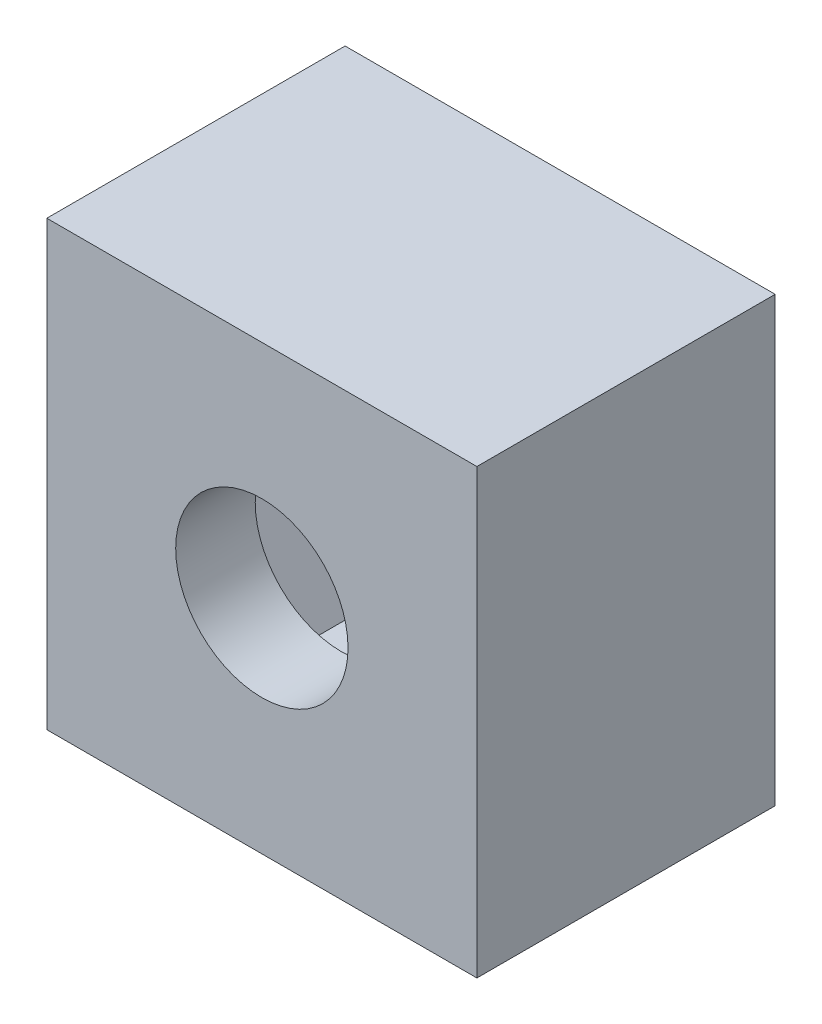
ISO-10303-21;
HEADER;
FILE_DESCRIPTION(('STEP AP214'),'2;1');
FILE_NAME('part.step','',(''),(''),'','','');
FILE_SCHEMA(('AUTOMOTIVE_DESIGN { 1 0 10303 214 1 1 1 1 }'));
ENDSEC;
DATA;
#1=APPLICATION_CONTEXT('core data for automotive mechanical design processes');
#2=APPLICATION_PROTOCOL_DEFINITION('international standard','automotive_design',2000,#1);
#3=PRODUCT_CONTEXT('',#1,'mechanical');
#4=PRODUCT('Part','Part','',(#3));
#5=PRODUCT_RELATED_PRODUCT_CATEGORY('part','',(#4));
#6=PRODUCT_DEFINITION_FORMATION('','',#4);
#7=PRODUCT_DEFINITION_CONTEXT('part definition',#1,'design');
#8=PRODUCT_DEFINITION('design','',#6,#7);
#9=PRODUCT_DEFINITION_SHAPE('','',#8);
#10=(LENGTH_UNIT() NAMED_UNIT(*) SI_UNIT(.MILLI.,.METRE.));
#11=(NAMED_UNIT(*) PLANE_ANGLE_UNIT() SI_UNIT($,.RADIAN.));
#12=(NAMED_UNIT(*) SI_UNIT($,.STERADIAN.) SOLID_ANGLE_UNIT());
#13=UNCERTAINTY_MEASURE_WITH_UNIT(LENGTH_MEASURE(1.E-05),#10,'distance_accuracy_value','');
#14=(GEOMETRIC_REPRESENTATION_CONTEXT(3) GLOBAL_UNCERTAINTY_ASSIGNED_CONTEXT((#13)) GLOBAL_UNIT_ASSIGNED_CONTEXT((#10,
#11,#12)) REPRESENTATION_CONTEXT('',''));
#15=CARTESIAN_POINT('',(0.,0.,0.));
#16=DIRECTION('',(0.,0.,1.));
#17=DIRECTION('',(1.,0.,0.));
#18=AXIS2_PLACEMENT_3D('',#15,#16,#17);
#19=CARTESIAN_POINT('',(0.,-8.35340964975421,5.25));
#20=DIRECTION('',(0.,1.,0.));
#21=DIRECTION('',(0.,0.,1.));
#22=AXIS2_PLACEMENT_3D('',#19,#20,#21);
#23=PLANE('',#22);
#24=DIRECTION('',(0.,0.,-1.));
#25=VECTOR('',#24,1.);
#26=CARTESIAN_POINT('',(-8.11027539957601,-8.35340964975421,5.25));
#27=LINE('',#26,#25);
#28=CARTESIAN_POINT('',(-8.11027539957601,-8.35340964975421,8.25));
#29=VERTEX_POINT('',#28);
#30=CARTESIAN_POINT('',(-8.11027539957601,-8.35340964975421,-3.));
#31=VERTEX_POINT('',#30);
#32=EDGE_CURVE('E110',#29,#31,#27,.T.);
#33=ORIENTED_EDGE('',*,*,#32,.T.);
#34=DIRECTION('',(1.,0.,0.));
#35=VECTOR('',#34,1.);
#36=CARTESIAN_POINT('',(0.,-8.35340964975421,-3.));
#37=LINE('',#36,#35);
#38=CARTESIAN_POINT('',(8.11027539957601,-8.35340964975421,-3.));
#39=VERTEX_POINT('',#38);
#40=EDGE_CURVE('E425',#31,#39,#37,.T.);
#41=ORIENTED_EDGE('',*,*,#40,.T.);
#42=DIRECTION('',(0.,0.,-1.));
#43=VECTOR('',#42,1.);
#44=CARTESIAN_POINT('',(8.11027539957601,-8.35340964975421,5.25));
#45=LINE('',#44,#43);
#46=CARTESIAN_POINT('',(8.11027539957601,-8.35340964975421,8.25));
#47=VERTEX_POINT('',#46);
#48=EDGE_CURVE('E11',#47,#39,#45,.T.);
#49=ORIENTED_EDGE('',*,*,#48,.F.);
#50=DIRECTION('',(1.,0.,0.));
#51=VECTOR('',#50,1.);
#52=CARTESIAN_POINT('',(-8.11027539957601,-8.35340964975421,8.25));
#53=LINE('',#52,#51);
#54=EDGE_CURVE('E388',#29,#47,#53,.T.);
#55=ORIENTED_EDGE('',*,*,#54,.F.);
#56=EDGE_LOOP('',(#33,#41,#49,#55));
#57=FACE_BOUND('',#56,.T.);
#58=ADVANCED_FACE('F39',(#57),#23,.F.);
#59=CARTESIAN_POINT('',(8.11027539957601,0.,5.25));
#60=DIRECTION('',(-1.,0.,0.));
#61=DIRECTION('',(0.,0.,1.));
#62=AXIS2_PLACEMENT_3D('',#59,#60,#61);
#63=PLANE('',#62);
#64=ORIENTED_EDGE('',*,*,#48,.T.);
#65=DIRECTION('',(0.,1.,0.));
#66=VECTOR('',#65,1.);
#67=CARTESIAN_POINT('',(8.11027539957601,0.,-3.));
#68=LINE('',#67,#66);
#69=CARTESIAN_POINT('',(8.11027539957601,8.35340964975421,-3.));
#70=VERTEX_POINT('',#69);
#71=EDGE_CURVE('E420',#39,#70,#68,.T.);
#72=ORIENTED_EDGE('',*,*,#71,.T.);
#73=DIRECTION('',(0.,0.,-1.));
#74=VECTOR('',#73,1.);
#75=CARTESIAN_POINT('',(8.11027539957601,8.35340964975421,5.25));
#76=LINE('',#75,#74);
#77=CARTESIAN_POINT('',(8.11027539957601,8.35340964975421,8.25));
#78=VERTEX_POINT('',#77);
#79=EDGE_CURVE('E49',#78,#70,#76,.T.);
#80=ORIENTED_EDGE('',*,*,#79,.F.);
#81=DIRECTION('',(0.,1.,0.));
#82=VECTOR('',#81,1.);
#83=CARTESIAN_POINT('',(8.11027539957601,8.35340964975421,8.25));
#84=LINE('',#83,#82);
#85=EDGE_CURVE('E391',#47,#78,#84,.T.);
#86=ORIENTED_EDGE('',*,*,#85,.F.);
#87=EDGE_LOOP('',(#64,#72,#80,#86));
#88=FACE_BOUND('',#87,.T.);
#89=ADVANCED_FACE('F162',(#88),#63,.F.);
#90=CARTESIAN_POINT('',(0.,8.35340964975421,5.25));
#91=DIRECTION('',(0.,1.,0.));
#92=DIRECTION('',(0.,0.,1.));
#93=AXIS2_PLACEMENT_3D('',#90,#91,#92);
#94=PLANE('',#93);
#95=ORIENTED_EDGE('',*,*,#79,.T.);
#96=DIRECTION('',(1.,0.,0.));
#97=VECTOR('',#96,1.);
#98=CARTESIAN_POINT('',(0.,8.35340964975421,-3.));
#99=LINE('',#98,#97);
#100=CARTESIAN_POINT('',(-8.11027539957601,8.35340964975421,-3.));
#101=VERTEX_POINT('',#100);
#102=EDGE_CURVE('E382',#101,#70,#99,.T.);
#103=ORIENTED_EDGE('',*,*,#102,.F.);
#104=DIRECTION('',(0.,0.,-1.));
#105=VECTOR('',#104,1.);
#106=CARTESIAN_POINT('',(-8.11027539957601,8.35340964975421,5.25));
#107=LINE('',#106,#105);
#108=CARTESIAN_POINT('',(-8.11027539957601,8.35340964975421,8.25));
#109=VERTEX_POINT('',#108);
#110=EDGE_CURVE('E113',#109,#101,#107,.T.);
#111=ORIENTED_EDGE('',*,*,#110,.F.);
#112=DIRECTION('',(-1.,0.,0.));
#113=VECTOR('',#112,1.);
#114=CARTESIAN_POINT('',(-8.11027539957601,8.35340964975421,8.25));
#115=LINE('',#114,#113);
#116=EDGE_CURVE('E143',#78,#109,#115,.T.);
#117=ORIENTED_EDGE('',*,*,#116,.F.);
#118=EDGE_LOOP('',(#95,#103,#111,#117));
#119=FACE_BOUND('',#118,.T.);
#120=ADVANCED_FACE('F168',(#119),#94,.T.);
#121=CARTESIAN_POINT('',(4.69097093716571,-2.70833333333333,5.25));
#122=DIRECTION('',(-0.866025403784439,0.5,0.));
#123=DIRECTION('',(-0.5,-0.866025403784439,0.));
#124=AXIS2_PLACEMENT_3D('',#121,#122,#123);
#125=PLANE('',#124);
#126=DIRECTION('',(0.5,0.866025403784439,0.));
#127=VECTOR('',#126,1.);
#128=CARTESIAN_POINT('',(4.69097093716571,-2.70833333333333,0.));
#129=LINE('',#128,#127);
#130=CARTESIAN_POINT('',(3.12731395811047,-5.41666666666668,0.));
#131=VERTEX_POINT('',#130);
#132=CARTESIAN_POINT('',(6.25462791622095,0.,0.));
#133=VERTEX_POINT('',#132);
#134=EDGE_CURVE('E102',#131,#133,#129,.T.);
#135=ORIENTED_EDGE('',*,*,#134,.F.);
#136=DIRECTION('',(0.,0.,-1.));
#137=VECTOR('',#136,1.);
#138=CARTESIAN_POINT('',(3.12731395811047,-5.41666666666668,5.25));
#139=LINE('',#138,#137);
#140=CARTESIAN_POINT('',(3.12731395811047,-5.41666666666668,5.25));
#141=VERTEX_POINT('',#140);
#142=EDGE_CURVE('E43',#141,#131,#139,.T.);
#143=ORIENTED_EDGE('',*,*,#142,.F.);
#144=DIRECTION('',(0.5,0.866025403784439,0.));
#145=VECTOR('',#144,1.);
#146=CARTESIAN_POINT('',(4.69097093716571,-2.70833333333333,5.25));
#147=LINE('',#146,#145);
#148=CARTESIAN_POINT('',(6.25462791622095,0.,5.25));
#149=VERTEX_POINT('',#148);
#150=EDGE_CURVE('E103',#141,#149,#147,.T.);
#151=ORIENTED_EDGE('',*,*,#150,.T.);
#152=DIRECTION('',(0.,0.,-1.));
#153=VECTOR('',#152,1.);
#154=CARTESIAN_POINT('',(6.25462791622095,0.,5.25));
#155=LINE('',#154,#153);
#156=EDGE_CURVE('E87',#149,#133,#155,.T.);
#157=ORIENTED_EDGE('',*,*,#156,.T.);
#158=EDGE_LOOP('',(#135,#143,#151,#157));
#159=FACE_BOUND('',#158,.T.);
#160=ADVANCED_FACE('F41',(#159),#125,.T.);
#161=CARTESIAN_POINT('',(0.,-5.41666666666668,5.25));
#162=DIRECTION('',(0.,1.,0.));
#163=DIRECTION('',(0.,0.,1.));
#164=AXIS2_PLACEMENT_3D('',#161,#162,#163);
#165=PLANE('',#164);
#166=DIRECTION('',(1.,0.,0.));
#167=VECTOR('',#166,1.);
#168=CARTESIAN_POINT('',(0.,-5.41666666666668,0.));
#169=LINE('',#168,#167);
#170=CARTESIAN_POINT('',(-3.12731395811048,-5.41666666666668,0.));
#171=VERTEX_POINT('',#170);
#172=EDGE_CURVE('E133',#171,#131,#169,.T.);
#173=ORIENTED_EDGE('',*,*,#172,.F.);
#174=DIRECTION('',(0.,0.,-1.));
#175=VECTOR('',#174,1.);
#176=CARTESIAN_POINT('',(-3.12731395811048,-5.41666666666668,5.25));
#177=LINE('',#176,#175);
#178=CARTESIAN_POINT('',(-3.12731395811048,-5.41666666666668,5.25));
#179=VERTEX_POINT('',#178);
#180=EDGE_CURVE('E121',#179,#171,#177,.T.);
#181=ORIENTED_EDGE('',*,*,#180,.F.);
#182=DIRECTION('',(1.,0.,0.));
#183=VECTOR('',#182,1.);
#184=CARTESIAN_POINT('',(0.,-5.41666666666668,5.25));
#185=LINE('',#184,#183);
#186=EDGE_CURVE('E106',#179,#141,#185,.T.);
#187=ORIENTED_EDGE('',*,*,#186,.T.);
#188=ORIENTED_EDGE('',*,*,#142,.T.);
#189=EDGE_LOOP('',(#173,#181,#187,#188));
#190=FACE_BOUND('',#189,.T.);
#191=ADVANCED_FACE('F132',(#190),#165,.T.);
#192=CARTESIAN_POINT('',(-4.69097093716572,-2.70833333333334,5.25));
#193=DIRECTION('',(0.866025403784438,0.5,0.));
#194=DIRECTION('',(-0.5,0.866025403784439,0.));
#195=AXIS2_PLACEMENT_3D('',#192,#193,#194);
#196=PLANE('',#195);
#197=DIRECTION('',(0.5,-0.866025403784438,0.));
#198=VECTOR('',#197,1.);
#199=CARTESIAN_POINT('',(-4.69097093716572,-2.70833333333334,0.));
#200=LINE('',#199,#198);
#201=CARTESIAN_POINT('',(-6.25462791622097,0.,0.));
#202=VERTEX_POINT('',#201);
#203=EDGE_CURVE('E140',#202,#171,#200,.T.);
#204=ORIENTED_EDGE('',*,*,#203,.F.);
#205=DIRECTION('',(0.,0.,-1.));
#206=VECTOR('',#205,1.);
#207=CARTESIAN_POINT('',(-6.25462791622097,0.,5.25));
#208=LINE('',#207,#206);
#209=CARTESIAN_POINT('',(-6.25462791622097,0.,5.25));
#210=VERTEX_POINT('',#209);
#211=EDGE_CURVE('E120',#210,#202,#208,.T.);
#212=ORIENTED_EDGE('',*,*,#211,.F.);
#213=DIRECTION('',(0.5,-0.866025403784438,0.));
#214=VECTOR('',#213,1.);
#215=CARTESIAN_POINT('',(-4.69097093716572,-2.70833333333334,5.25));
#216=LINE('',#215,#214);
#217=EDGE_CURVE('E397',#210,#179,#216,.T.);
#218=ORIENTED_EDGE('',*,*,#217,.T.);
#219=ORIENTED_EDGE('',*,*,#180,.T.);
#220=EDGE_LOOP('',(#204,#212,#218,#219));
#221=FACE_BOUND('',#220,.T.);
#222=ADVANCED_FACE('F153',(#221),#196,.T.);
#223=CARTESIAN_POINT('',(-4.69097093716573,2.70833333333334,5.25));
#224=DIRECTION('',(0.866025403784439,-0.499999999999999,0.));
#225=DIRECTION('',(0.499999999999999,0.866025403784439,0.));
#226=AXIS2_PLACEMENT_3D('',#223,#224,#225);
#227=PLANE('',#226);
#228=DIRECTION('',(-0.499999999999999,-0.866025403784439,0.));
#229=VECTOR('',#228,1.);
#230=CARTESIAN_POINT('',(-4.69097093716573,2.70833333333334,0.));
#231=LINE('',#230,#229);
#232=CARTESIAN_POINT('',(-3.12731395811048,5.41666666666669,0.));
#233=VERTEX_POINT('',#232);
#234=EDGE_CURVE('E96',#233,#202,#231,.T.);
#235=ORIENTED_EDGE('',*,*,#234,.F.);
#236=DIRECTION('',(0.,0.,-1.));
#237=VECTOR('',#236,1.);
#238=CARTESIAN_POINT('',(-3.12731395811048,5.41666666666669,5.25));
#239=LINE('',#238,#237);
#240=CARTESIAN_POINT('',(-3.12731395811048,5.41666666666669,5.25));
#241=VERTEX_POINT('',#240);
#242=EDGE_CURVE('E86',#241,#233,#239,.T.);
#243=ORIENTED_EDGE('',*,*,#242,.F.);
#244=DIRECTION('',(-0.499999999999999,-0.866025403784439,0.));
#245=VECTOR('',#244,1.);
#246=CARTESIAN_POINT('',(-4.69097093716573,2.70833333333334,5.25));
#247=LINE('',#246,#245);
#248=EDGE_CURVE('E152',#241,#210,#247,.T.);
#249=ORIENTED_EDGE('',*,*,#248,.T.);
#250=ORIENTED_EDGE('',*,*,#211,.T.);
#251=EDGE_LOOP('',(#235,#243,#249,#250));
#252=FACE_BOUND('',#251,.T.);
#253=ADVANCED_FACE('F147',(#252),#227,.T.);
#254=CARTESIAN_POINT('',(0.,5.41666666666669,5.25));
#255=DIRECTION('',(0.,-1.,0.));
#256=DIRECTION('',(0.,0.,-1.));
#257=AXIS2_PLACEMENT_3D('',#254,#255,#256);
#258=PLANE('',#257);
#259=DIRECTION('',(-1.,0.,0.));
#260=VECTOR('',#259,1.);
#261=CARTESIAN_POINT('',(0.,5.41666666666669,0.));
#262=LINE('',#261,#260);
#263=CARTESIAN_POINT('',(3.12731395811046,5.41666666666669,0.));
#264=VERTEX_POINT('',#263);
#265=EDGE_CURVE('E90',#264,#233,#262,.T.);
#266=ORIENTED_EDGE('',*,*,#265,.F.);
#267=DIRECTION('',(0.,0.,-1.));
#268=VECTOR('',#267,1.);
#269=CARTESIAN_POINT('',(3.12731395811046,5.41666666666669,5.25));
#270=LINE('',#269,#268);
#271=CARTESIAN_POINT('',(3.12731395811046,5.41666666666669,5.25));
#272=VERTEX_POINT('',#271);
#273=EDGE_CURVE('E77',#272,#264,#270,.T.);
#274=ORIENTED_EDGE('',*,*,#273,.F.);
#275=DIRECTION('',(-1.,0.,0.));
#276=VECTOR('',#275,1.);
#277=CARTESIAN_POINT('',(0.,5.41666666666669,5.25));
#278=LINE('',#277,#276);
#279=EDGE_CURVE('E57',#272,#241,#278,.T.);
#280=ORIENTED_EDGE('',*,*,#279,.T.);
#281=ORIENTED_EDGE('',*,*,#242,.T.);
#282=EDGE_LOOP('',(#266,#274,#280,#281));
#283=FACE_BOUND('',#282,.T.);
#284=ADVANCED_FACE('F91',(#283),#258,.T.);
#285=CARTESIAN_POINT('',(4.69097093716571,2.70833333333334,5.25));
#286=DIRECTION('',(-0.866025403784438,-0.5,0.));
#287=DIRECTION('',(0.5,-0.866025403784438,0.));
#288=AXIS2_PLACEMENT_3D('',#285,#286,#287);
#289=PLANE('',#288);
#290=DIRECTION('',(-0.5,0.866025403784438,0.));
#291=VECTOR('',#290,1.);
#292=CARTESIAN_POINT('',(4.69097093716571,2.70833333333334,0.));
#293=LINE('',#292,#291);
#294=EDGE_CURVE('E82',#133,#264,#293,.T.);
#295=ORIENTED_EDGE('',*,*,#294,.F.);
#296=ORIENTED_EDGE('',*,*,#156,.F.);
#297=DIRECTION('',(-0.5,0.866025403784438,0.));
#298=VECTOR('',#297,1.);
#299=CARTESIAN_POINT('',(4.69097093716571,2.70833333333334,5.25));
#300=LINE('',#299,#298);
#301=EDGE_CURVE('E84',#149,#272,#300,.T.);
#302=ORIENTED_EDGE('',*,*,#301,.T.);
#303=ORIENTED_EDGE('',*,*,#273,.T.);
#304=EDGE_LOOP('',(#295,#296,#302,#303));
#305=FACE_BOUND('',#304,.T.);
#306=ADVANCED_FACE('F79',(#305),#289,.T.);
#307=CARTESIAN_POINT('',(-8.11027539957601,0.,5.25));
#308=DIRECTION('',(-1.,0.,0.));
#309=DIRECTION('',(0.,0.,1.));
#310=AXIS2_PLACEMENT_3D('',#307,#308,#309);
#311=PLANE('',#310);
#312=ORIENTED_EDGE('',*,*,#110,.T.);
#313=DIRECTION('',(0.,1.,0.));
#314=VECTOR('',#313,1.);
#315=CARTESIAN_POINT('',(-8.11027539957601,0.,-3.));
#316=LINE('',#315,#314);
#317=EDGE_CURVE('E376',#31,#101,#316,.T.);
#318=ORIENTED_EDGE('',*,*,#317,.F.);
#319=ORIENTED_EDGE('',*,*,#32,.F.);
#320=DIRECTION('',(0.,-1.,0.));
#321=VECTOR('',#320,1.);
#322=CARTESIAN_POINT('',(-8.11027539957601,8.35340964975421,8.25));
#323=LINE('',#322,#321);
#324=EDGE_CURVE('E379',#109,#29,#323,.T.);
#325=ORIENTED_EDGE('',*,*,#324,.F.);
#326=EDGE_LOOP('',(#312,#318,#319,#325));
#327=FACE_BOUND('',#326,.T.);
#328=ADVANCED_FACE('F175',(#327),#311,.T.);
#329=CARTESIAN_POINT('',(0.,0.,8.25));
#330=DIRECTION('',(0.,0.,1.));
#331=DIRECTION('',(1.,0.,0.));
#332=AXIS2_PLACEMENT_3D('',#329,#330,#331);
#333=PLANE('',#332);
#334=ORIENTED_EDGE('',*,*,#324,.T.);
#335=ORIENTED_EDGE('',*,*,#54,.T.);
#336=ORIENTED_EDGE('',*,*,#85,.T.);
#337=ORIENTED_EDGE('',*,*,#116,.T.);
#338=EDGE_LOOP('',(#334,#335,#336,#337));
#339=FACE_BOUND('',#338,.T.);
#340=CARTESIAN_POINT('',(0.,0.,8.25));
#341=DIRECTION('',(0.,0.,1.));
#342=DIRECTION('',(1.,0.,0.));
#343=AXIS2_PLACEMENT_3D('',#340,#341,#342);
#344=CIRCLE('',#343,3.25);
#345=CARTESIAN_POINT('',(3.25,0.,8.25));
#346=VERTEX_POINT('',#345);
#347=EDGE_CURVE('E375',#346,#346,#344,.T.);
#348=ORIENTED_EDGE('',*,*,#347,.F.);
#349=EDGE_LOOP('',(#348));
#350=FACE_BOUND('',#349,.T.);
#351=ADVANCED_FACE('F191',(#339,#350),#333,.T.);
#352=CARTESIAN_POINT('',(0.,0.,5.25));
#353=DIRECTION('',(0.,0.,1.));
#354=DIRECTION('',(1.,0.,0.));
#355=AXIS2_PLACEMENT_3D('',#352,#353,#354);
#356=PLANE('',#355);
#357=ORIENTED_EDGE('',*,*,#150,.F.);
#358=ORIENTED_EDGE('',*,*,#186,.F.);
#359=ORIENTED_EDGE('',*,*,#217,.F.);
#360=ORIENTED_EDGE('',*,*,#248,.F.);
#361=ORIENTED_EDGE('',*,*,#279,.F.);
#362=ORIENTED_EDGE('',*,*,#301,.F.);
#363=EDGE_LOOP('',(#357,#358,#359,#360,#361,#362));
#364=FACE_BOUND('',#363,.T.);
#365=CARTESIAN_POINT('',(0.,0.,5.25));
#366=DIRECTION('',(0.,0.,1.));
#367=DIRECTION('',(1.,0.,0.));
#368=AXIS2_PLACEMENT_3D('',#365,#366,#367);
#369=CIRCLE('',#368,3.25);
#370=CARTESIAN_POINT('',(3.25,0.,5.25));
#371=VERTEX_POINT('',#370);
#372=EDGE_CURVE('E373',#371,#371,#369,.T.);
#373=ORIENTED_EDGE('',*,*,#372,.T.);
#374=EDGE_LOOP('',(#373));
#375=FACE_BOUND('',#374,.T.);
#376=ADVANCED_FACE('F200',(#364,#375),#356,.F.);
#377=CARTESIAN_POINT('',(0.,0.,8.25));
#378=DIRECTION('',(0.,0.,-1.));
#379=DIRECTION('',(-1.,0.,0.));
#380=AXIS2_PLACEMENT_3D('',#377,#378,#379);
#381=CYLINDRICAL_SURFACE('',#380,3.25);
#382=ORIENTED_EDGE('',*,*,#347,.T.);
#383=EDGE_LOOP('',(#382));
#384=FACE_BOUND('',#383,.T.);
#385=ORIENTED_EDGE('',*,*,#372,.F.);
#386=EDGE_LOOP('',(#385));
#387=FACE_BOUND('',#386,.T.);
#388=ADVANCED_FACE('F208',(#384,#387),#381,.F.);
#389=CARTESIAN_POINT('',(0.,0.,-3.));
#390=DIRECTION('',(0.,0.,1.));
#391=DIRECTION('',(1.,0.,0.));
#392=AXIS2_PLACEMENT_3D('',#389,#390,#391);
#393=CYLINDRICAL_SURFACE('',#392,3.25);
#394=CARTESIAN_POINT('',(0.,0.,-3.));
#395=DIRECTION('',(0.,0.,1.));
#396=DIRECTION('',(1.,0.,0.));
#397=AXIS2_PLACEMENT_3D('',#394,#395,#396);
#398=CIRCLE('',#397,3.25);
#399=CARTESIAN_POINT('',(3.25,0.,-3.));
#400=VERTEX_POINT('',#399);
#401=EDGE_CURVE('E430',#400,#400,#398,.T.);
#402=ORIENTED_EDGE('',*,*,#401,.F.);
#403=EDGE_LOOP('',(#402));
#404=FACE_BOUND('',#403,.T.);
#405=CARTESIAN_POINT('',(0.,0.,0.));
#406=DIRECTION('',(0.,0.,1.));
#407=DIRECTION('',(1.,0.,0.));
#408=AXIS2_PLACEMENT_3D('',#405,#406,#407);
#409=CIRCLE('',#408,3.25);
#410=CARTESIAN_POINT('',(3.25,0.,0.));
#411=VERTEX_POINT('',#410);
#412=EDGE_CURVE('E428',#411,#411,#409,.T.);
#413=ORIENTED_EDGE('',*,*,#412,.T.);
#414=EDGE_LOOP('',(#413));
#415=FACE_BOUND('',#414,.T.);
#416=ADVANCED_FACE('F215',(#404,#415),#393,.F.);
#417=CARTESIAN_POINT('',(0.,0.,-3.));
#418=DIRECTION('',(0.,0.,1.));
#419=DIRECTION('',(1.,0.,0.));
#420=AXIS2_PLACEMENT_3D('',#417,#418,#419);
#421=PLANE('',#420);
#422=ORIENTED_EDGE('',*,*,#401,.T.);
#423=EDGE_LOOP('',(#422));
#424=FACE_BOUND('',#423,.T.);
#425=ORIENTED_EDGE('',*,*,#40,.F.);
#426=ORIENTED_EDGE('',*,*,#317,.T.);
#427=ORIENTED_EDGE('',*,*,#102,.T.);
#428=ORIENTED_EDGE('',*,*,#71,.F.);
#429=EDGE_LOOP('',(#425,#426,#427,#428));
#430=FACE_BOUND('',#429,.T.);
#431=ADVANCED_FACE('F222',(#424,#430),#421,.F.);
#432=CARTESIAN_POINT('',(0.,0.,0.));
#433=DIRECTION('',(0.,0.,1.));
#434=DIRECTION('',(1.,0.,0.));
#435=AXIS2_PLACEMENT_3D('',#432,#433,#434);
#436=PLANE('',#435);
#437=ORIENTED_EDGE('',*,*,#172,.T.);
#438=ORIENTED_EDGE('',*,*,#134,.T.);
#439=ORIENTED_EDGE('',*,*,#294,.T.);
#440=ORIENTED_EDGE('',*,*,#265,.T.);
#441=ORIENTED_EDGE('',*,*,#234,.T.);
#442=ORIENTED_EDGE('',*,*,#203,.T.);
#443=EDGE_LOOP('',(#437,#438,#439,#440,#441,#442));
#444=FACE_BOUND('',#443,.T.);
#445=ORIENTED_EDGE('',*,*,#412,.F.);
#446=EDGE_LOOP('',(#445));
#447=FACE_BOUND('',#446,.T.);
#448=ADVANCED_FACE('F99',(#444,#447),#436,.T.);
#449=CLOSED_SHELL('',(#58,#89,#120,#160,#191,#222,#253,#284,#306,#328,#351,#376,#388,#416,#431,#448));
#450=MANIFOLD_SOLID_BREP('B2',#449);
#451=ADVANCED_BREP_SHAPE_REPRESENTATION('',(#18,#450),#14);
#452=SHAPE_DEFINITION_REPRESENTATION(#9,#451);
ENDSEC;
END-ISO-10303-21;
